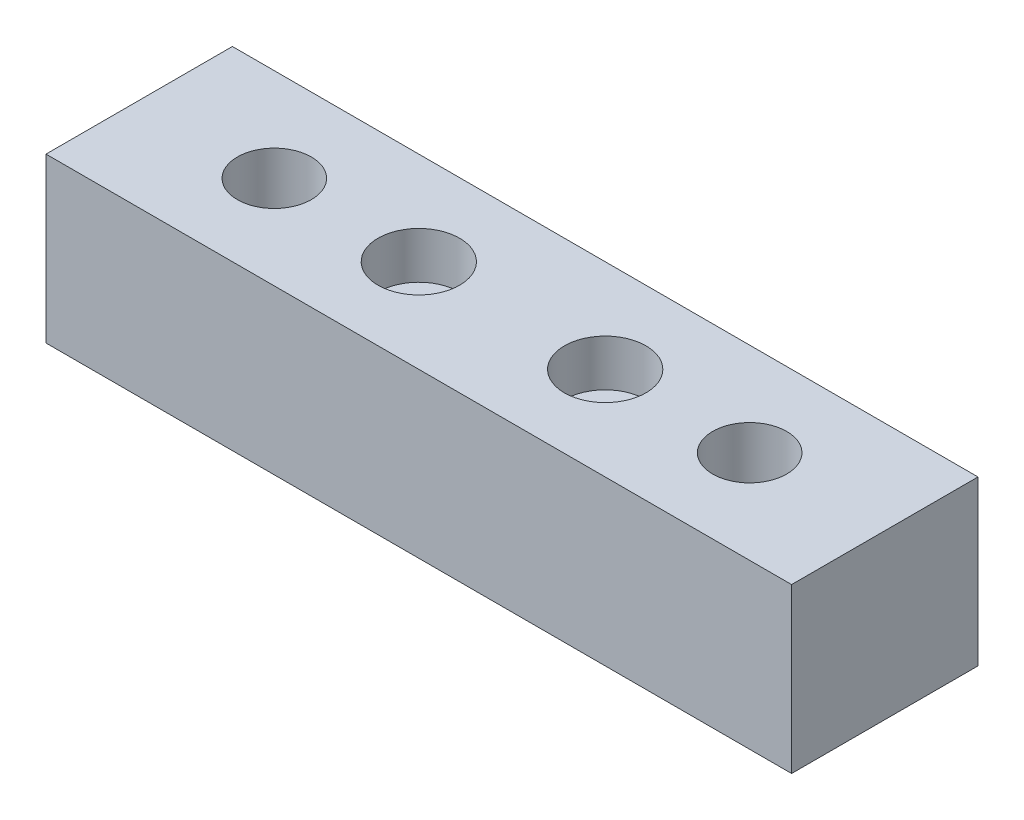
ISO-10303-21;
HEADER;
FILE_DESCRIPTION(('STEP AP214'),'2;1');
FILE_NAME('part.step','',(''),(''),'','','');
FILE_SCHEMA(('AUTOMOTIVE_DESIGN { 1 0 10303 214 1 1 1 1 }'));
ENDSEC;
DATA;
#1=APPLICATION_CONTEXT('core data for automotive mechanical design processes');
#2=APPLICATION_PROTOCOL_DEFINITION('international standard','automotive_design',2000,#1);
#3=PRODUCT_CONTEXT('',#1,'mechanical');
#4=PRODUCT('Part','Part','',(#3));
#5=PRODUCT_RELATED_PRODUCT_CATEGORY('part','',(#4));
#6=PRODUCT_DEFINITION_FORMATION('','',#4);
#7=PRODUCT_DEFINITION_CONTEXT('part definition',#1,'design');
#8=PRODUCT_DEFINITION('design','',#6,#7);
#9=PRODUCT_DEFINITION_SHAPE('','',#8);
#10=(LENGTH_UNIT() NAMED_UNIT(*) SI_UNIT(.MILLI.,.METRE.));
#11=(NAMED_UNIT(*) PLANE_ANGLE_UNIT() SI_UNIT($,.RADIAN.));
#12=(NAMED_UNIT(*) SI_UNIT($,.STERADIAN.) SOLID_ANGLE_UNIT());
#13=UNCERTAINTY_MEASURE_WITH_UNIT(LENGTH_MEASURE(1.E-05),#10,'distance_accuracy_value','');
#14=(GEOMETRIC_REPRESENTATION_CONTEXT(3) GLOBAL_UNCERTAINTY_ASSIGNED_CONTEXT((#13)) GLOBAL_UNIT_ASSIGNED_CONTEXT((#10,
#11,#12)) REPRESENTATION_CONTEXT('',''));
#15=CARTESIAN_POINT('',(0.,0.,0.));
#16=DIRECTION('',(0.,0.,1.));
#17=DIRECTION('',(1.,0.,0.));
#18=AXIS2_PLACEMENT_3D('',#15,#16,#17);
#19=CARTESIAN_POINT('',(-50.8,12.7000000000002,80.01));
#20=DIRECTION('',(0.,-1.,0.));
#21=DIRECTION('',(1.,0.,0.));
#22=AXIS2_PLACEMENT_3D('',#19,#20,#21);
#23=PLANE('',#22);
#24=CARTESIAN_POINT('',(-12.7,12.7000000000002,-162.55));
#25=DIRECTION('',(0.,-1.,0.));
#26=DIRECTION('',(1.,0.,0.));
#27=AXIS2_PLACEMENT_3D('',#24,#25,#26);
#28=CIRCLE('',#27,3.3782);
#29=CARTESIAN_POINT('',(-9.3218,12.7000000000001,-162.55));
#30=VERTEX_POINT('',#29);
#31=EDGE_CURVE('E196',#30,#30,#28,.T.);
#32=ORIENTED_EDGE('',*,*,#31,.F.);
#33=EDGE_LOOP('',(#32));
#34=FACE_BOUND('',#33,.T.);
#35=CARTESIAN_POINT('',(12.7,12.7000000000001,-162.55));
#36=DIRECTION('',(0.,-1.,0.));
#37=DIRECTION('',(1.,0.,0.));
#38=AXIS2_PLACEMENT_3D('',#35,#36,#37);
#39=CIRCLE('',#38,3.3782);
#40=CARTESIAN_POINT('',(16.0782,12.7000000000001,-162.55));
#41=VERTEX_POINT('',#40);
#42=EDGE_CURVE('E112',#41,#41,#39,.T.);
#43=ORIENTED_EDGE('',*,*,#42,.F.);
#44=EDGE_LOOP('',(#43));
#45=FACE_BOUND('',#44,.T.);
#46=CARTESIAN_POINT('',(-32.385,12.7000000000002,-162.55));
#47=DIRECTION('',(0.,-1.,0.));
#48=DIRECTION('',(1.,0.,0.));
#49=AXIS2_PLACEMENT_3D('',#46,#47,#48);
#50=CIRCLE('',#49,11.1125);
#51=CARTESIAN_POINT('',(-21.2725,12.7000000000002,-162.55));
#52=VERTEX_POINT('',#51);
#53=EDGE_CURVE('E137',#52,#52,#50,.F.);
#54=ORIENTED_EDGE('',*,*,#53,.T.);
#55=EDGE_LOOP('',(#54));
#56=FACE_BOUND('',#55,.T.);
#57=DIRECTION('',(0.,0.,1.));
#58=VECTOR('',#57,1.);
#59=CARTESIAN_POINT('',(50.8,12.7,0.));
#60=LINE('',#59,#58);
#61=CARTESIAN_POINT('',(50.8,12.7,-175.25));
#62=VERTEX_POINT('',#61);
#63=CARTESIAN_POINT('',(50.8,12.7,-149.85));
#64=VERTEX_POINT('',#63);
#65=EDGE_CURVE('E95',#62,#64,#60,.T.);
#66=ORIENTED_EDGE('',*,*,#65,.T.);
#67=DIRECTION('',(-1.,0.,0.));
#68=VECTOR('',#67,1.);
#69=CARTESIAN_POINT('',(0.,12.7,-149.85));
#70=LINE('',#69,#68);
#71=CARTESIAN_POINT('',(-50.8,12.7000000000002,-149.85));
#72=VERTEX_POINT('',#71);
#73=EDGE_CURVE('E53',#64,#72,#70,.T.);
#74=ORIENTED_EDGE('',*,*,#73,.T.);
#75=DIRECTION('',(0.,0.,1.));
#76=VECTOR('',#75,1.);
#77=CARTESIAN_POINT('',(-50.8,12.7000000000002,-149.85));
#78=LINE('',#77,#76);
#79=CARTESIAN_POINT('',(-50.8,12.7000000000002,-175.25));
#80=VERTEX_POINT('',#79);
#81=EDGE_CURVE('E67',#80,#72,#78,.T.);
#82=ORIENTED_EDGE('',*,*,#81,.F.);
#83=DIRECTION('',(1.,0.,0.));
#84=VECTOR('',#83,1.);
#85=CARTESIAN_POINT('',(0.,12.7,-175.25));
#86=LINE('',#85,#84);
#87=EDGE_CURVE('E108',#80,#62,#86,.T.);
#88=ORIENTED_EDGE('',*,*,#87,.T.);
#89=EDGE_LOOP('',(#66,#74,#82,#88));
#90=FACE_BOUND('',#89,.T.);
#91=CARTESIAN_POINT('',(32.385,12.7,-162.55));
#92=DIRECTION('',(0.,-1.,0.));
#93=DIRECTION('',(1.,0.,0.));
#94=AXIS2_PLACEMENT_3D('',#91,#92,#93);
#95=CIRCLE('',#94,11.1125);
#96=CARTESIAN_POINT('',(43.4975,12.7,-162.55));
#97=VERTEX_POINT('',#96);
#98=EDGE_CURVE('E174',#97,#97,#95,.F.);
#99=ORIENTED_EDGE('',*,*,#98,.T.);
#100=EDGE_LOOP('',(#99));
#101=FACE_BOUND('',#100,.T.);
#102=ADVANCED_FACE('F49',(#34,#45,#56,#90,#101),#23,.T.);
#103=CARTESIAN_POINT('',(-50.8,35.,-149.85));
#104=DIRECTION('',(-1.,0.,0.));
#105=DIRECTION('',(0.,0.,1.));
#106=AXIS2_PLACEMENT_3D('',#103,#104,#105);
#107=PLANE('',#106);
#108=DIRECTION('',(0.,-1.,0.));
#109=VECTOR('',#108,1.);
#110=CARTESIAN_POINT('',(-50.8,35.,-175.25));
#111=LINE('',#110,#109);
#112=CARTESIAN_POINT('',(-50.8,35.,-175.25));
#113=VERTEX_POINT('',#112);
#114=EDGE_CURVE('E131',#113,#80,#111,.T.);
#115=ORIENTED_EDGE('',*,*,#114,.T.);
#116=ORIENTED_EDGE('',*,*,#81,.T.);
#117=DIRECTION('',(0.,-1.,0.));
#118=VECTOR('',#117,1.);
#119=CARTESIAN_POINT('',(-50.8,35.,-149.85));
#120=LINE('',#119,#118);
#121=CARTESIAN_POINT('',(-50.8,35.,-149.85));
#122=VERTEX_POINT('',#121);
#123=EDGE_CURVE('E104',#122,#72,#120,.T.);
#124=ORIENTED_EDGE('',*,*,#123,.F.);
#125=DIRECTION('',(0.,0.,-1.));
#126=VECTOR('',#125,1.);
#127=CARTESIAN_POINT('',(-50.8,35.,-149.85));
#128=LINE('',#127,#126);
#129=EDGE_CURVE('E141',#122,#113,#128,.T.);
#130=ORIENTED_EDGE('',*,*,#129,.T.);
#131=EDGE_LOOP('',(#115,#116,#124,#130));
#132=FACE_BOUND('',#131,.T.);
#133=ADVANCED_FACE('F240',(#132),#107,.T.);
#134=CARTESIAN_POINT('',(50.8,35.,-149.85));
#135=DIRECTION('',(1.,0.,0.));
#136=DIRECTION('',(0.,0.,-1.));
#137=AXIS2_PLACEMENT_3D('',#134,#135,#136);
#138=PLANE('',#137);
#139=ORIENTED_EDGE('',*,*,#65,.F.);
#140=DIRECTION('',(0.,-1.,0.));
#141=VECTOR('',#140,1.);
#142=CARTESIAN_POINT('',(50.8,35.,-175.25));
#143=LINE('',#142,#141);
#144=CARTESIAN_POINT('',(50.8,35.,-175.25));
#145=VERTEX_POINT('',#144);
#146=EDGE_CURVE('E134',#145,#62,#143,.T.);
#147=ORIENTED_EDGE('',*,*,#146,.F.);
#148=DIRECTION('',(0.,0.,1.));
#149=VECTOR('',#148,1.);
#150=CARTESIAN_POINT('',(50.8,35.,-149.85));
#151=LINE('',#150,#149);
#152=CARTESIAN_POINT('',(50.8,35.,-149.85));
#153=VERTEX_POINT('',#152);
#154=EDGE_CURVE('E97',#145,#153,#151,.T.);
#155=ORIENTED_EDGE('',*,*,#154,.T.);
#156=DIRECTION('',(0.,-1.,0.));
#157=VECTOR('',#156,1.);
#158=CARTESIAN_POINT('',(50.8,35.,-149.85));
#159=LINE('',#158,#157);
#160=EDGE_CURVE('E92',#153,#64,#159,.T.);
#161=ORIENTED_EDGE('',*,*,#160,.T.);
#162=EDGE_LOOP('',(#139,#147,#155,#161));
#163=FACE_BOUND('',#162,.T.);
#164=ADVANCED_FACE('F94',(#163),#138,.T.);
#165=CARTESIAN_POINT('',(-50.8,35.,-175.25));
#166=DIRECTION('',(0.,0.,-1.));
#167=DIRECTION('',(-1.,0.,0.));
#168=AXIS2_PLACEMENT_3D('',#165,#166,#167);
#169=PLANE('',#168);
#170=ORIENTED_EDGE('',*,*,#87,.F.);
#171=ORIENTED_EDGE('',*,*,#114,.F.);
#172=DIRECTION('',(1.,0.,0.));
#173=VECTOR('',#172,1.);
#174=CARTESIAN_POINT('',(-50.8,35.,-175.25));
#175=LINE('',#174,#173);
#176=EDGE_CURVE('E103',#113,#145,#175,.T.);
#177=ORIENTED_EDGE('',*,*,#176,.T.);
#178=ORIENTED_EDGE('',*,*,#146,.T.);
#179=EDGE_LOOP('',(#170,#171,#177,#178));
#180=FACE_BOUND('',#179,.T.);
#181=ADVANCED_FACE('F239',(#180),#169,.T.);
#182=CARTESIAN_POINT('',(-50.8,35.,-149.85));
#183=DIRECTION('',(0.,0.,1.));
#184=DIRECTION('',(1.,0.,0.));
#185=AXIS2_PLACEMENT_3D('',#182,#183,#184);
#186=PLANE('',#185);
#187=ORIENTED_EDGE('',*,*,#123,.T.);
#188=ORIENTED_EDGE('',*,*,#73,.F.);
#189=ORIENTED_EDGE('',*,*,#160,.F.);
#190=DIRECTION('',(-1.,0.,0.));
#191=VECTOR('',#190,1.);
#192=CARTESIAN_POINT('',(-50.8,35.,-149.85));
#193=LINE('',#192,#191);
#194=EDGE_CURVE('E145',#153,#122,#193,.T.);
#195=ORIENTED_EDGE('',*,*,#194,.T.);
#196=EDGE_LOOP('',(#187,#188,#189,#195));
#197=FACE_BOUND('',#196,.T.);
#198=ADVANCED_FACE('F110',(#197),#186,.T.);
#199=CARTESIAN_POINT('',(0.,35.,0.));
#200=DIRECTION('',(0.,-1.,0.));
#201=DIRECTION('',(0.,0.,-1.));
#202=AXIS2_PLACEMENT_3D('',#199,#200,#201);
#203=PLANE('',#202);
#204=CARTESIAN_POINT('',(-12.7,35.,-162.55));
#205=DIRECTION('',(0.,1.,0.));
#206=DIRECTION('',(0.,0.,1.));
#207=AXIS2_PLACEMENT_3D('',#204,#205,#206);
#208=CIRCLE('',#207,5.55625);
#209=CARTESIAN_POINT('',(-12.7,35.,-156.99375));
#210=VERTEX_POINT('',#209);
#211=EDGE_CURVE('E214',#210,#210,#208,.T.);
#212=ORIENTED_EDGE('',*,*,#211,.F.);
#213=EDGE_LOOP('',(#212));
#214=FACE_BOUND('',#213,.T.);
#215=CARTESIAN_POINT('',(12.7,35.,-162.55));
#216=DIRECTION('',(0.,1.,0.));
#217=DIRECTION('',(0.,0.,1.));
#218=AXIS2_PLACEMENT_3D('',#215,#216,#217);
#219=CIRCLE('',#218,5.55625);
#220=CARTESIAN_POINT('',(12.7,35.,-156.99375));
#221=VERTEX_POINT('',#220);
#222=EDGE_CURVE('E191',#221,#221,#219,.T.);
#223=ORIENTED_EDGE('',*,*,#222,.F.);
#224=EDGE_LOOP('',(#223));
#225=FACE_BOUND('',#224,.T.);
#226=CARTESIAN_POINT('',(32.385,35.,-162.55));
#227=DIRECTION('',(0.,-1.,0.));
#228=DIRECTION('',(0.,0.,-1.));
#229=AXIS2_PLACEMENT_3D('',#226,#227,#228);
#230=CIRCLE('',#229,5.04189999999999);
#231=CARTESIAN_POINT('',(32.385,35.,-167.5919));
#232=VERTEX_POINT('',#231);
#233=EDGE_CURVE('E162',#232,#232,#230,.T.);
#234=ORIENTED_EDGE('',*,*,#233,.T.);
#235=EDGE_LOOP('',(#234));
#236=FACE_BOUND('',#235,.T.);
#237=CARTESIAN_POINT('',(-32.385,35.,-162.55));
#238=DIRECTION('',(0.,-1.,0.));
#239=DIRECTION('',(0.,0.,-1.));
#240=AXIS2_PLACEMENT_3D('',#237,#238,#239);
#241=CIRCLE('',#240,5.04189999999999);
#242=CARTESIAN_POINT('',(-32.385,35.,-167.5919));
#243=VERTEX_POINT('',#242);
#244=EDGE_CURVE('E150',#243,#243,#241,.T.);
#245=ORIENTED_EDGE('',*,*,#244,.T.);
#246=EDGE_LOOP('',(#245));
#247=FACE_BOUND('',#246,.T.);
#248=ORIENTED_EDGE('',*,*,#154,.F.);
#249=ORIENTED_EDGE('',*,*,#176,.F.);
#250=ORIENTED_EDGE('',*,*,#129,.F.);
#251=ORIENTED_EDGE('',*,*,#194,.F.);
#252=EDGE_LOOP('',(#248,#249,#250,#251));
#253=FACE_BOUND('',#252,.T.);
#254=ADVANCED_FACE('F225',(#214,#225,#236,#247,#253),#203,.F.);
#255=CARTESIAN_POINT('',(37.4269,25.4,-162.55));
#256=DIRECTION('',(0.,1.,0.));
#257=DIRECTION('',(0.,0.,1.));
#258=AXIS2_PLACEMENT_3D('',#255,#256,#257);
#259=PLANE('',#258);
#260=CARTESIAN_POINT('',(32.385,25.4,-162.55));
#261=DIRECTION('',(0.,-1.,0.));
#262=DIRECTION('',(0.,0.,-1.));
#263=AXIS2_PLACEMENT_3D('',#260,#261,#262);
#264=CIRCLE('',#263,5.04189999999999);
#265=CARTESIAN_POINT('',(32.385,25.4,-167.5919));
#266=VERTEX_POINT('',#265);
#267=EDGE_CURVE('E59',#266,#266,#264,.T.);
#268=ORIENTED_EDGE('',*,*,#267,.F.);
#269=EDGE_LOOP('',(#268));
#270=FACE_BOUND('',#269,.T.);
#271=CARTESIAN_POINT('',(32.385,25.4,-162.55));
#272=DIRECTION('',(0.,-1.,0.));
#273=DIRECTION('',(0.,0.,-1.));
#274=AXIS2_PLACEMENT_3D('',#271,#272,#273);
#275=CIRCLE('',#274,11.1125);
#276=CARTESIAN_POINT('',(32.385,25.4,-173.6625));
#277=VERTEX_POINT('',#276);
#278=EDGE_CURVE('E11',#277,#277,#275,.T.);
#279=ORIENTED_EDGE('',*,*,#278,.T.);
#280=EDGE_LOOP('',(#279));
#281=FACE_BOUND('',#280,.T.);
#282=ADVANCED_FACE('F228',(#270,#281),#259,.F.);
#283=CARTESIAN_POINT('',(32.385,0.,-162.55));
#284=DIRECTION('',(0.,-1.,0.));
#285=DIRECTION('',(0.,0.,-1.));
#286=AXIS2_PLACEMENT_3D('',#283,#284,#285);
#287=CYLINDRICAL_SURFACE('',#286,11.1125);
#288=ORIENTED_EDGE('',*,*,#278,.F.);
#289=EDGE_LOOP('',(#288));
#290=FACE_BOUND('',#289,.T.);
#291=ORIENTED_EDGE('',*,*,#98,.F.);
#292=EDGE_LOOP('',(#291));
#293=FACE_BOUND('',#292,.T.);
#294=ADVANCED_FACE('F266',(#290,#293),#287,.F.);
#295=CARTESIAN_POINT('',(32.385,0.,-162.55));
#296=DIRECTION('',(0.,-1.,0.));
#297=DIRECTION('',(0.,0.,-1.));
#298=AXIS2_PLACEMENT_3D('',#295,#296,#297);
#299=CYLINDRICAL_SURFACE('',#298,5.04189999999999);
#300=ORIENTED_EDGE('',*,*,#233,.F.);
#301=EDGE_LOOP('',(#300));
#302=FACE_BOUND('',#301,.T.);
#303=ORIENTED_EDGE('',*,*,#267,.T.);
#304=EDGE_LOOP('',(#303));
#305=FACE_BOUND('',#304,.T.);
#306=ADVANCED_FACE('F263',(#302,#305),#299,.F.);
#307=CARTESIAN_POINT('',(-32.385,0.,-162.55));
#308=DIRECTION('',(0.,-1.,0.));
#309=DIRECTION('',(0.,0.,-1.));
#310=AXIS2_PLACEMENT_3D('',#307,#308,#309);
#311=CYLINDRICAL_SURFACE('',#310,11.1125);
#312=CARTESIAN_POINT('',(-32.385,25.4,-162.55));
#313=DIRECTION('',(0.,-1.,0.));
#314=DIRECTION('',(0.,0.,-1.));
#315=AXIS2_PLACEMENT_3D('',#312,#313,#314);
#316=CIRCLE('',#315,11.1125);
#317=CARTESIAN_POINT('',(-32.385,25.4,-173.6625));
#318=VERTEX_POINT('',#317);
#319=EDGE_CURVE('E158',#318,#318,#316,.T.);
#320=ORIENTED_EDGE('',*,*,#319,.F.);
#321=EDGE_LOOP('',(#320));
#322=FACE_BOUND('',#321,.T.);
#323=ORIENTED_EDGE('',*,*,#53,.F.);
#324=EDGE_LOOP('',(#323));
#325=FACE_BOUND('',#324,.T.);
#326=ADVANCED_FACE('F51',(#322,#325),#311,.F.);
#327=CARTESIAN_POINT('',(-32.385,0.,-162.55));
#328=DIRECTION('',(0.,-1.,0.));
#329=DIRECTION('',(0.,0.,-1.));
#330=AXIS2_PLACEMENT_3D('',#327,#328,#329);
#331=CYLINDRICAL_SURFACE('',#330,5.04189999999999);
#332=ORIENTED_EDGE('',*,*,#244,.F.);
#333=EDGE_LOOP('',(#332));
#334=FACE_BOUND('',#333,.T.);
#335=CARTESIAN_POINT('',(-32.385,25.4,-162.55));
#336=DIRECTION('',(0.,-1.,0.));
#337=DIRECTION('',(0.,0.,-1.));
#338=AXIS2_PLACEMENT_3D('',#335,#336,#337);
#339=CIRCLE('',#338,5.04189999999999);
#340=CARTESIAN_POINT('',(-32.385,25.4,-167.5919));
#341=VERTEX_POINT('',#340);
#342=EDGE_CURVE('E154',#341,#341,#339,.T.);
#343=ORIENTED_EDGE('',*,*,#342,.T.);
#344=EDGE_LOOP('',(#343));
#345=FACE_BOUND('',#344,.T.);
#346=ADVANCED_FACE('F251',(#334,#345),#331,.F.);
#347=CARTESIAN_POINT('',(-27.3431,25.4,-162.55));
#348=DIRECTION('',(0.,1.,0.));
#349=DIRECTION('',(0.,0.,1.));
#350=AXIS2_PLACEMENT_3D('',#347,#348,#349);
#351=PLANE('',#350);
#352=ORIENTED_EDGE('',*,*,#342,.F.);
#353=EDGE_LOOP('',(#352));
#354=FACE_BOUND('',#353,.T.);
#355=ORIENTED_EDGE('',*,*,#319,.T.);
#356=EDGE_LOOP('',(#355));
#357=FACE_BOUND('',#356,.T.);
#358=ADVANCED_FACE('F258',(#354,#357),#351,.F.);
#359=CARTESIAN_POINT('',(12.7,35.,-162.55));
#360=DIRECTION('',(0.,1.,0.));
#361=DIRECTION('',(0.,0.,1.));
#362=AXIS2_PLACEMENT_3D('',#359,#360,#361);
#363=CYLINDRICAL_SURFACE('',#362,3.3782);
#364=CARTESIAN_POINT('',(12.7,28.65,-162.55));
#365=DIRECTION('',(0.,1.,0.));
#366=DIRECTION('',(0.,0.,1.));
#367=AXIS2_PLACEMENT_3D('',#364,#365,#366);
#368=CIRCLE('',#367,3.3782);
#369=CARTESIAN_POINT('',(12.7,28.65,-159.1718));
#370=VERTEX_POINT('',#369);
#371=EDGE_CURVE('E117',#370,#370,#368,.T.);
#372=ORIENTED_EDGE('',*,*,#371,.T.);
#373=EDGE_LOOP('',(#372));
#374=FACE_BOUND('',#373,.T.);
#375=ORIENTED_EDGE('',*,*,#42,.T.);
#376=EDGE_LOOP('',(#375));
#377=FACE_BOUND('',#376,.T.);
#378=ADVANCED_FACE('F250',(#374,#377),#363,.F.);
#379=CARTESIAN_POINT('',(16.0782,28.65,-162.55));
#380=DIRECTION('',(0.,-1.,0.));
#381=DIRECTION('',(0.,0.,-1.));
#382=AXIS2_PLACEMENT_3D('',#379,#380,#381);
#383=PLANE('',#382);
#384=ORIENTED_EDGE('',*,*,#371,.F.);
#385=EDGE_LOOP('',(#384));
#386=FACE_BOUND('',#385,.T.);
#387=CARTESIAN_POINT('',(12.7,28.65,-162.55));
#388=DIRECTION('',(0.,1.,0.));
#389=DIRECTION('',(0.,0.,1.));
#390=AXIS2_PLACEMENT_3D('',#387,#388,#389);
#391=CIRCLE('',#390,5.55625);
#392=CARTESIAN_POINT('',(12.7,28.65,-156.99375));
#393=VERTEX_POINT('',#392);
#394=EDGE_CURVE('E125',#393,#393,#391,.T.);
#395=ORIENTED_EDGE('',*,*,#394,.T.);
#396=EDGE_LOOP('',(#395));
#397=FACE_BOUND('',#396,.T.);
#398=ADVANCED_FACE('F321',(#386,#397),#383,.F.);
#399=CARTESIAN_POINT('',(12.7,35.,-162.55));
#400=DIRECTION('',(0.,1.,0.));
#401=DIRECTION('',(0.,0.,1.));
#402=AXIS2_PLACEMENT_3D('',#399,#400,#401);
#403=CYLINDRICAL_SURFACE('',#402,5.55625);
#404=ORIENTED_EDGE('',*,*,#394,.F.);
#405=EDGE_LOOP('',(#404));
#406=FACE_BOUND('',#405,.T.);
#407=ORIENTED_EDGE('',*,*,#222,.T.);
#408=EDGE_LOOP('',(#407));
#409=FACE_BOUND('',#408,.T.);
#410=ADVANCED_FACE('F330',(#406,#409),#403,.F.);
#411=CARTESIAN_POINT('',(-12.7,35.,-162.55));
#412=DIRECTION('',(0.,1.,0.));
#413=DIRECTION('',(0.,0.,1.));
#414=AXIS2_PLACEMENT_3D('',#411,#412,#413);
#415=CYLINDRICAL_SURFACE('',#414,3.3782);
#416=CARTESIAN_POINT('',(-12.7,28.65,-162.55));
#417=DIRECTION('',(0.,1.,0.));
#418=DIRECTION('',(0.,0.,1.));
#419=AXIS2_PLACEMENT_3D('',#416,#417,#418);
#420=CIRCLE('',#419,3.3782);
#421=CARTESIAN_POINT('',(-12.7,28.65,-159.1718));
#422=VERTEX_POINT('',#421);
#423=EDGE_CURVE('E202',#422,#422,#420,.T.);
#424=ORIENTED_EDGE('',*,*,#423,.T.);
#425=EDGE_LOOP('',(#424));
#426=FACE_BOUND('',#425,.T.);
#427=ORIENTED_EDGE('',*,*,#31,.T.);
#428=EDGE_LOOP('',(#427));
#429=FACE_BOUND('',#428,.T.);
#430=ADVANCED_FACE('F339',(#426,#429),#415,.F.);
#431=CARTESIAN_POINT('',(-9.3218,28.65,-162.55));
#432=DIRECTION('',(0.,-1.,0.));
#433=DIRECTION('',(0.,0.,-1.));
#434=AXIS2_PLACEMENT_3D('',#431,#432,#433);
#435=PLANE('',#434);
#436=ORIENTED_EDGE('',*,*,#423,.F.);
#437=EDGE_LOOP('',(#436));
#438=FACE_BOUND('',#437,.T.);
#439=CARTESIAN_POINT('',(-12.7,28.65,-162.55));
#440=DIRECTION('',(0.,1.,0.));
#441=DIRECTION('',(0.,0.,1.));
#442=AXIS2_PLACEMENT_3D('',#439,#440,#441);
#443=CIRCLE('',#442,5.55625);
#444=CARTESIAN_POINT('',(-12.7,28.65,-156.99375));
#445=VERTEX_POINT('',#444);
#446=EDGE_CURVE('E208',#445,#445,#443,.T.);
#447=ORIENTED_EDGE('',*,*,#446,.T.);
#448=EDGE_LOOP('',(#447));
#449=FACE_BOUND('',#448,.T.);
#450=ADVANCED_FACE('F348',(#438,#449),#435,.F.);
#451=CARTESIAN_POINT('',(-12.7,35.,-162.55));
#452=DIRECTION('',(0.,1.,0.));
#453=DIRECTION('',(0.,0.,1.));
#454=AXIS2_PLACEMENT_3D('',#451,#452,#453);
#455=CYLINDRICAL_SURFACE('',#454,5.55625);
#456=ORIENTED_EDGE('',*,*,#446,.F.);
#457=EDGE_LOOP('',(#456));
#458=FACE_BOUND('',#457,.T.);
#459=ORIENTED_EDGE('',*,*,#211,.T.);
#460=EDGE_LOOP('',(#459));
#461=FACE_BOUND('',#460,.T.);
#462=ADVANCED_FACE('F223',(#458,#461),#455,.F.);
#463=CLOSED_SHELL('',(#102,#133,#164,#181,#198,#254,#282,#294,#306,#326,#346,#358,#378,#398,
#410,#430,#450,#462));
#464=MANIFOLD_SOLID_BREP('B2',#463);
#465=ADVANCED_BREP_SHAPE_REPRESENTATION('',(#18,#464),#14);
#466=SHAPE_DEFINITION_REPRESENTATION(#9,#465);
ENDSEC;
END-ISO-10303-21;
